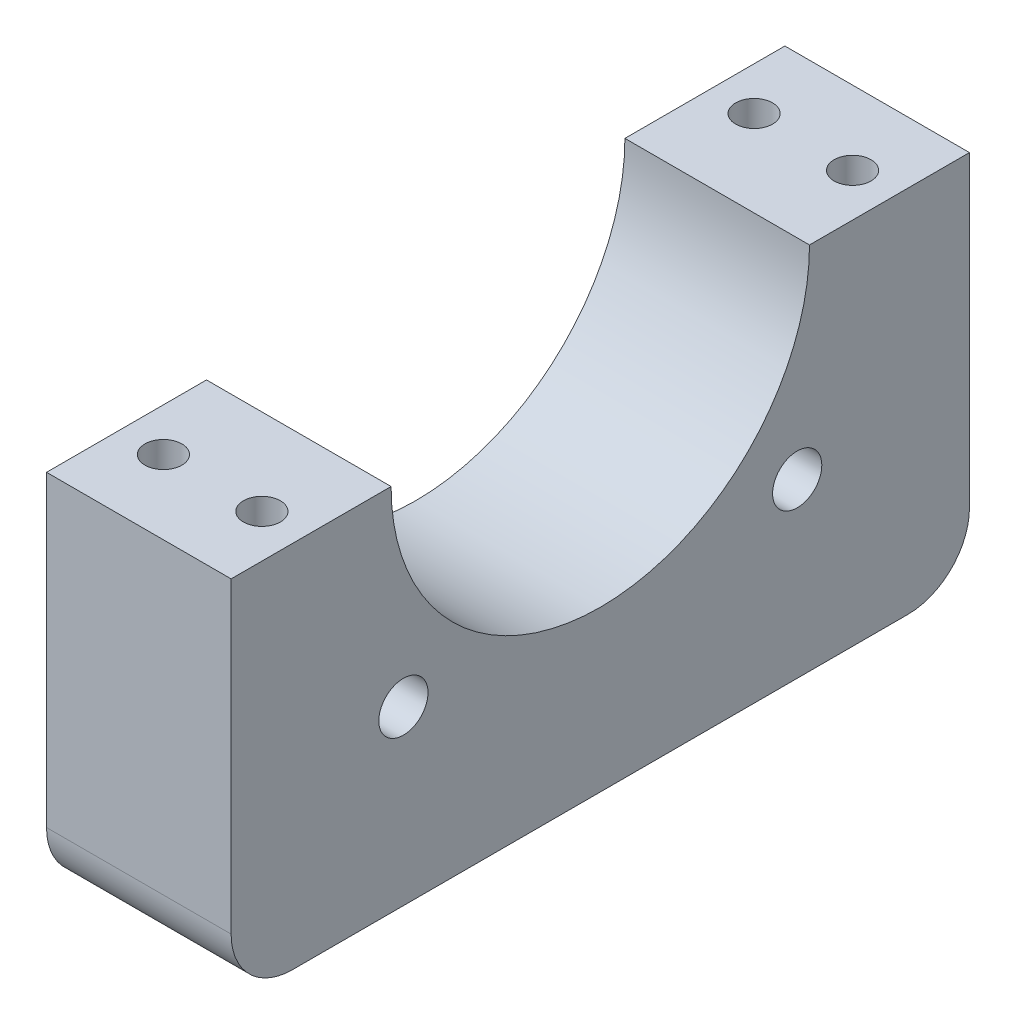
ISO-10303-21;
HEADER;
FILE_DESCRIPTION(('STEP AP214'),'2;1');
FILE_NAME('part.step','',(''),(''),'','','');
FILE_SCHEMA(('AUTOMOTIVE_DESIGN { 1 0 10303 214 1 1 1 1 }'));
ENDSEC;
DATA;
#1=APPLICATION_CONTEXT('core data for automotive mechanical design processes');
#2=APPLICATION_PROTOCOL_DEFINITION('international standard','automotive_design',2000,#1);
#3=PRODUCT_CONTEXT('',#1,'mechanical');
#4=PRODUCT('Part','Part','',(#3));
#5=PRODUCT_RELATED_PRODUCT_CATEGORY('part','',(#4));
#6=PRODUCT_DEFINITION_FORMATION('','',#4);
#7=PRODUCT_DEFINITION_CONTEXT('part definition',#1,'design');
#8=PRODUCT_DEFINITION('design','',#6,#7);
#9=PRODUCT_DEFINITION_SHAPE('','',#8);
#10=(LENGTH_UNIT() NAMED_UNIT(*) SI_UNIT(.MILLI.,.METRE.));
#11=(NAMED_UNIT(*) PLANE_ANGLE_UNIT() SI_UNIT($,.RADIAN.));
#12=(NAMED_UNIT(*) SI_UNIT($,.STERADIAN.) SOLID_ANGLE_UNIT());
#13=UNCERTAINTY_MEASURE_WITH_UNIT(LENGTH_MEASURE(1.E-05),#10,'distance_accuracy_value','');
#14=(GEOMETRIC_REPRESENTATION_CONTEXT(3) GLOBAL_UNCERTAINTY_ASSIGNED_CONTEXT((#13)) GLOBAL_UNIT_ASSIGNED_CONTEXT((#10,
#11,#12)) REPRESENTATION_CONTEXT('',''));
#15=CARTESIAN_POINT('',(0.,0.,0.));
#16=DIRECTION('',(0.,0.,1.));
#17=DIRECTION('',(1.,0.,0.));
#18=AXIS2_PLACEMENT_3D('',#15,#16,#17);
#19=CARTESIAN_POINT('',(-4.,-13.,-24.));
#20=DIRECTION('',(0.,1.,0.));
#21=DIRECTION('',(0.,0.,1.));
#22=AXIS2_PLACEMENT_3D('',#19,#20,#21);
#23=CYLINDRICAL_SURFACE('',#22,1.5);
#24=CARTESIAN_POINT('',(-4.,30.,-24.));
#25=DIRECTION('',(0.,1.,0.));
#26=DIRECTION('',(0.,0.,1.));
#27=AXIS2_PLACEMENT_3D('',#24,#25,#26);
#28=CIRCLE('',#27,1.5);
#29=CARTESIAN_POINT('',(-4.,30.,-22.5));
#30=VERTEX_POINT('',#29);
#31=EDGE_CURVE('E325',#30,#30,#28,.T.);
#32=ORIENTED_EDGE('',*,*,#31,.T.);
#33=EDGE_LOOP('',(#32));
#34=FACE_BOUND('',#33,.T.);
#35=CARTESIAN_POINT('',(-4.,10.,-24.));
#36=DIRECTION('',(0.,-1.,0.));
#37=DIRECTION('',(0.,0.,-1.));
#38=AXIS2_PLACEMENT_3D('',#35,#36,#37);
#39=CIRCLE('',#38,1.5);
#40=CARTESIAN_POINT('',(-4.,10.,-25.5));
#41=VERTEX_POINT('',#40);
#42=EDGE_CURVE('E186',#41,#41,#39,.F.);
#43=ORIENTED_EDGE('',*,*,#42,.F.);
#44=EDGE_LOOP('',(#43));
#45=FACE_BOUND('',#44,.T.);
#46=ADVANCED_FACE('F39',(#34,#45),#23,.F.);
#47=CARTESIAN_POINT('',(4.00000000000001,-13.,-24.));
#48=DIRECTION('',(0.,1.,0.));
#49=DIRECTION('',(0.,0.,1.));
#50=AXIS2_PLACEMENT_3D('',#47,#48,#49);
#51=CYLINDRICAL_SURFACE('',#50,1.5);
#52=CARTESIAN_POINT('',(4.00000000000001,30.,-24.));
#53=DIRECTION('',(0.,1.,0.));
#54=DIRECTION('',(0.,0.,1.));
#55=AXIS2_PLACEMENT_3D('',#52,#53,#54);
#56=CIRCLE('',#55,1.5);
#57=CARTESIAN_POINT('',(4.00000000000001,30.,-22.5));
#58=VERTEX_POINT('',#57);
#59=EDGE_CURVE('E322',#58,#58,#56,.T.);
#60=ORIENTED_EDGE('',*,*,#59,.T.);
#61=EDGE_LOOP('',(#60));
#62=FACE_BOUND('',#61,.T.);
#63=CARTESIAN_POINT('',(4.00000000000001,10.,-24.));
#64=DIRECTION('',(0.,-1.,0.));
#65=DIRECTION('',(0.,0.,-1.));
#66=AXIS2_PLACEMENT_3D('',#63,#64,#65);
#67=CIRCLE('',#66,1.5);
#68=CARTESIAN_POINT('',(4.00000000000001,10.,-25.5));
#69=VERTEX_POINT('',#68);
#70=EDGE_CURVE('E183',#69,#69,#67,.F.);
#71=ORIENTED_EDGE('',*,*,#70,.F.);
#72=EDGE_LOOP('',(#71));
#73=FACE_BOUND('',#72,.T.);
#74=ADVANCED_FACE('F353',(#62,#73),#51,.F.);
#75=CARTESIAN_POINT('',(4.00000000000001,-13.,24.));
#76=DIRECTION('',(0.,1.,0.));
#77=DIRECTION('',(0.,0.,1.));
#78=AXIS2_PLACEMENT_3D('',#75,#76,#77);
#79=CYLINDRICAL_SURFACE('',#78,1.5);
#80=CARTESIAN_POINT('',(4.00000000000001,30.,24.));
#81=DIRECTION('',(0.,1.,0.));
#82=DIRECTION('',(0.,0.,1.));
#83=AXIS2_PLACEMENT_3D('',#80,#81,#82);
#84=CIRCLE('',#83,1.5);
#85=CARTESIAN_POINT('',(4.00000000000001,30.,25.5));
#86=VERTEX_POINT('',#85);
#87=EDGE_CURVE('E310',#86,#86,#84,.T.);
#88=ORIENTED_EDGE('',*,*,#87,.T.);
#89=EDGE_LOOP('',(#88));
#90=FACE_BOUND('',#89,.T.);
#91=CARTESIAN_POINT('',(4.00000000000001,10.,24.));
#92=DIRECTION('',(0.,-1.,0.));
#93=DIRECTION('',(0.,0.,-1.));
#94=AXIS2_PLACEMENT_3D('',#91,#92,#93);
#95=CIRCLE('',#94,1.5);
#96=CARTESIAN_POINT('',(4.00000000000001,10.,22.5));
#97=VERTEX_POINT('',#96);
#98=EDGE_CURVE('E179',#97,#97,#95,.F.);
#99=ORIENTED_EDGE('',*,*,#98,.F.);
#100=EDGE_LOOP('',(#99));
#101=FACE_BOUND('',#100,.T.);
#102=ADVANCED_FACE('F359',(#90,#101),#79,.F.);
#103=CARTESIAN_POINT('',(-4.,-13.,24.));
#104=DIRECTION('',(0.,1.,0.));
#105=DIRECTION('',(0.,0.,1.));
#106=AXIS2_PLACEMENT_3D('',#103,#104,#105);
#107=CYLINDRICAL_SURFACE('',#106,1.5);
#108=CARTESIAN_POINT('',(-4.,30.,24.));
#109=DIRECTION('',(0.,1.,0.));
#110=DIRECTION('',(0.,0.,1.));
#111=AXIS2_PLACEMENT_3D('',#108,#109,#110);
#112=CIRCLE('',#111,1.5);
#113=CARTESIAN_POINT('',(-4.,30.,25.5));
#114=VERTEX_POINT('',#113);
#115=EDGE_CURVE('E321',#114,#114,#112,.T.);
#116=ORIENTED_EDGE('',*,*,#115,.T.);
#117=EDGE_LOOP('',(#116));
#118=FACE_BOUND('',#117,.T.);
#119=CARTESIAN_POINT('',(-4.,10.,24.));
#120=DIRECTION('',(0.,-1.,0.));
#121=DIRECTION('',(0.,0.,-1.));
#122=AXIS2_PLACEMENT_3D('',#119,#120,#121);
#123=CIRCLE('',#122,1.5);
#124=CARTESIAN_POINT('',(-4.,10.,22.5));
#125=VERTEX_POINT('',#124);
#126=EDGE_CURVE('E176',#125,#125,#123,.F.);
#127=ORIENTED_EDGE('',*,*,#126,.F.);
#128=EDGE_LOOP('',(#127));
#129=FACE_BOUND('',#128,.T.);
#130=ADVANCED_FACE('F364',(#118,#129),#107,.F.);
#131=CARTESIAN_POINT('',(-7.5,70.,30.));
#132=DIRECTION('',(1.,0.,0.));
#133=DIRECTION('',(0.,0.,-1.));
#134=AXIS2_PLACEMENT_3D('',#131,#132,#133);
#135=PLANE('',#134);
#136=DIRECTION('',(0.,0.,1.));
#137=VECTOR('',#136,1.);
#138=CARTESIAN_POINT('',(-7.5,0.,30.));
#139=LINE('',#138,#137);
#140=CARTESIAN_POINT('',(-7.5,0.,-25.));
#141=VERTEX_POINT('',#140);
#142=CARTESIAN_POINT('',(-7.5,0.,25.));
#143=VERTEX_POINT('',#142);
#144=EDGE_CURVE('E266',#141,#143,#139,.T.);
#145=ORIENTED_EDGE('',*,*,#144,.T.);
#146=CARTESIAN_POINT('',(-7.5,5.,25.));
#147=DIRECTION('',(1.,0.,0.));
#148=DIRECTION('',(0.,0.,-1.));
#149=AXIS2_PLACEMENT_3D('',#146,#147,#148);
#150=CIRCLE('',#149,5.);
#151=CARTESIAN_POINT('',(-7.5,5.,30.));
#152=VERTEX_POINT('',#151);
#153=EDGE_CURVE('E249',#143,#152,#150,.F.);
#154=ORIENTED_EDGE('',*,*,#153,.T.);
#155=DIRECTION('',(0.,-1.,0.));
#156=VECTOR('',#155,1.);
#157=CARTESIAN_POINT('',(-7.5,70.,30.));
#158=LINE('',#157,#156);
#159=CARTESIAN_POINT('',(-7.5,30.,30.));
#160=VERTEX_POINT('',#159);
#161=EDGE_CURVE('E162',#160,#152,#158,.T.);
#162=ORIENTED_EDGE('',*,*,#161,.F.);
#163=DIRECTION('',(0.,0.,-1.));
#164=VECTOR('',#163,1.);
#165=CARTESIAN_POINT('',(-7.5,30.,30.));
#166=LINE('',#165,#164);
#167=CARTESIAN_POINT('',(-7.5,30.,17.));
#168=VERTEX_POINT('',#167);
#169=EDGE_CURVE('E141',#160,#168,#166,.T.);
#170=ORIENTED_EDGE('',*,*,#169,.T.);
#171=CARTESIAN_POINT('',(-7.5,30.,0.));
#172=DIRECTION('',(1.,0.,0.));
#173=DIRECTION('',(0.,0.,-1.));
#174=AXIS2_PLACEMENT_3D('',#171,#172,#173);
#175=CIRCLE('',#174,17.);
#176=CARTESIAN_POINT('',(-7.5,30.,-17.));
#177=VERTEX_POINT('',#176);
#178=EDGE_CURVE('E268',#168,#177,#175,.T.);
#179=ORIENTED_EDGE('',*,*,#178,.T.);
#180=CARTESIAN_POINT('',(-7.5,30.,-30.));
#181=VERTEX_POINT('',#180);
#182=EDGE_CURVE('E277',#177,#181,#166,.T.);
#183=ORIENTED_EDGE('',*,*,#182,.T.);
#184=DIRECTION('',(0.,-1.,0.));
#185=VECTOR('',#184,1.);
#186=CARTESIAN_POINT('',(-7.5,70.,-30.));
#187=LINE('',#186,#185);
#188=CARTESIAN_POINT('',(-7.5,5.,-30.));
#189=VERTEX_POINT('',#188);
#190=EDGE_CURVE('E168',#181,#189,#187,.T.);
#191=ORIENTED_EDGE('',*,*,#190,.T.);
#192=CARTESIAN_POINT('',(-7.5,5.,-25.));
#193=DIRECTION('',(1.,0.,0.));
#194=DIRECTION('',(0.,0.,-1.));
#195=AXIS2_PLACEMENT_3D('',#192,#193,#194);
#196=CIRCLE('',#195,5.);
#197=EDGE_CURVE('E60',#189,#141,#196,.F.);
#198=ORIENTED_EDGE('',*,*,#197,.T.);
#199=EDGE_LOOP('',(#145,#154,#162,#170,#179,#183,#191,#198));
#200=FACE_BOUND('',#199,.T.);
#201=ADVANCED_FACE('F265',(#200),#135,.F.);
#202=CARTESIAN_POINT('',(7.5,70.,30.));
#203=DIRECTION('',(0.,0.,-1.));
#204=DIRECTION('',(-1.,0.,0.));
#205=AXIS2_PLACEMENT_3D('',#202,#203,#204);
#206=PLANE('',#205);
#207=ORIENTED_EDGE('',*,*,#161,.T.);
#208=DIRECTION('',(1.,0.,0.));
#209=VECTOR('',#208,1.);
#210=CARTESIAN_POINT('',(7.5,5.,30.));
#211=LINE('',#210,#209);
#212=CARTESIAN_POINT('',(7.5,5.,30.));
#213=VERTEX_POINT('',#212);
#214=EDGE_CURVE('E161',#152,#213,#211,.T.);
#215=ORIENTED_EDGE('',*,*,#214,.T.);
#216=DIRECTION('',(0.,-1.,0.));
#217=VECTOR('',#216,1.);
#218=CARTESIAN_POINT('',(7.5,70.,30.));
#219=LINE('',#218,#217);
#220=CARTESIAN_POINT('',(7.5,30.,30.));
#221=VERTEX_POINT('',#220);
#222=EDGE_CURVE('E152',#221,#213,#219,.T.);
#223=ORIENTED_EDGE('',*,*,#222,.F.);
#224=DIRECTION('',(1.,0.,0.));
#225=VECTOR('',#224,1.);
#226=CARTESIAN_POINT('',(-21.5,30.,30.));
#227=LINE('',#226,#225);
#228=EDGE_CURVE('E135',#160,#221,#227,.T.);
#229=ORIENTED_EDGE('',*,*,#228,.F.);
#230=EDGE_LOOP('',(#207,#215,#223,#229));
#231=FACE_BOUND('',#230,.T.);
#232=ADVANCED_FACE('F159',(#231),#206,.F.);
#233=CARTESIAN_POINT('',(7.5,70.,30.));
#234=DIRECTION('',(-1.,0.,0.));
#235=DIRECTION('',(0.,0.,1.));
#236=AXIS2_PLACEMENT_3D('',#233,#234,#235);
#237=PLANE('',#236);
#238=CARTESIAN_POINT('',(7.5,14.,16.));
#239=DIRECTION('',(1.,0.,0.));
#240=DIRECTION('',(0.,0.,-1.));
#241=AXIS2_PLACEMENT_3D('',#238,#239,#240);
#242=CIRCLE('',#241,2.);
#243=CARTESIAN_POINT('',(7.5,14.,14.));
#244=VERTEX_POINT('',#243);
#245=EDGE_CURVE('E311',#244,#244,#242,.T.);
#246=ORIENTED_EDGE('',*,*,#245,.F.);
#247=EDGE_LOOP('',(#246));
#248=FACE_BOUND('',#247,.T.);
#249=CARTESIAN_POINT('',(7.5,14.,-16.));
#250=DIRECTION('',(1.,0.,0.));
#251=DIRECTION('',(0.,0.,-1.));
#252=AXIS2_PLACEMENT_3D('',#249,#250,#251);
#253=CIRCLE('',#252,2.);
#254=CARTESIAN_POINT('',(7.5,14.,-18.));
#255=VERTEX_POINT('',#254);
#256=EDGE_CURVE('E314',#255,#255,#253,.T.);
#257=ORIENTED_EDGE('',*,*,#256,.F.);
#258=EDGE_LOOP('',(#257));
#259=FACE_BOUND('',#258,.T.);
#260=ORIENTED_EDGE('',*,*,#222,.T.);
#261=CARTESIAN_POINT('',(7.5,5.,25.));
#262=DIRECTION('',(-1.,0.,0.));
#263=DIRECTION('',(0.,0.,1.));
#264=AXIS2_PLACEMENT_3D('',#261,#262,#263);
#265=CIRCLE('',#264,5.);
#266=CARTESIAN_POINT('',(7.5,0.,25.));
#267=VERTEX_POINT('',#266);
#268=EDGE_CURVE('E193',#213,#267,#265,.F.);
#269=ORIENTED_EDGE('',*,*,#268,.T.);
#270=DIRECTION('',(0.,0.,-1.));
#271=VECTOR('',#270,1.);
#272=CARTESIAN_POINT('',(7.5,0.,30.));
#273=LINE('',#272,#271);
#274=CARTESIAN_POINT('',(7.5,0.,-25.));
#275=VERTEX_POINT('',#274);
#276=EDGE_CURVE('E267',#267,#275,#273,.T.);
#277=ORIENTED_EDGE('',*,*,#276,.T.);
#278=CARTESIAN_POINT('',(7.5,5.,-25.));
#279=DIRECTION('',(-1.,0.,0.));
#280=DIRECTION('',(0.,0.,1.));
#281=AXIS2_PLACEMENT_3D('',#278,#279,#280);
#282=CIRCLE('',#281,5.);
#283=CARTESIAN_POINT('',(7.5,5.,-30.));
#284=VERTEX_POINT('',#283);
#285=EDGE_CURVE('E191',#275,#284,#282,.F.);
#286=ORIENTED_EDGE('',*,*,#285,.T.);
#287=DIRECTION('',(0.,-1.,0.));
#288=VECTOR('',#287,1.);
#289=CARTESIAN_POINT('',(7.5,70.,-30.));
#290=LINE('',#289,#288);
#291=CARTESIAN_POINT('',(7.5,30.,-30.));
#292=VERTEX_POINT('',#291);
#293=EDGE_CURVE('E163',#292,#284,#290,.T.);
#294=ORIENTED_EDGE('',*,*,#293,.F.);
#295=DIRECTION('',(0.,0.,-1.));
#296=VECTOR('',#295,1.);
#297=CARTESIAN_POINT('',(7.5,30.,30.));
#298=LINE('',#297,#296);
#299=CARTESIAN_POINT('',(7.50000000000001,30.,-17.));
#300=VERTEX_POINT('',#299);
#301=EDGE_CURVE('E156',#300,#292,#298,.T.);
#302=ORIENTED_EDGE('',*,*,#301,.F.);
#303=CARTESIAN_POINT('',(7.5,30.,0.));
#304=DIRECTION('',(1.,0.,0.));
#305=DIRECTION('',(0.,0.,-1.));
#306=AXIS2_PLACEMENT_3D('',#303,#304,#305);
#307=CIRCLE('',#306,17.);
#308=CARTESIAN_POINT('',(7.5,30.,17.));
#309=VERTEX_POINT('',#308);
#310=EDGE_CURVE('E155',#309,#300,#307,.T.);
#311=ORIENTED_EDGE('',*,*,#310,.F.);
#312=EDGE_CURVE('E138',#221,#309,#298,.T.);
#313=ORIENTED_EDGE('',*,*,#312,.F.);
#314=EDGE_LOOP('',(#260,#269,#277,#286,#294,#302,#311,#313));
#315=FACE_BOUND('',#314,.T.);
#316=ADVANCED_FACE('F151',(#248,#259,#315),#237,.F.);
#317=CARTESIAN_POINT('',(7.5,70.,-30.));
#318=DIRECTION('',(0.,0.,1.));
#319=DIRECTION('',(1.,0.,0.));
#320=AXIS2_PLACEMENT_3D('',#317,#318,#319);
#321=PLANE('',#320);
#322=ORIENTED_EDGE('',*,*,#293,.T.);
#323=DIRECTION('',(-1.,0.,0.));
#324=VECTOR('',#323,1.);
#325=CARTESIAN_POINT('',(7.5,5.,-30.));
#326=LINE('',#325,#324);
#327=EDGE_CURVE('E247',#284,#189,#326,.T.);
#328=ORIENTED_EDGE('',*,*,#327,.T.);
#329=ORIENTED_EDGE('',*,*,#190,.F.);
#330=DIRECTION('',(1.,0.,0.));
#331=VECTOR('',#330,1.);
#332=CARTESIAN_POINT('',(-21.5,30.,-30.));
#333=LINE('',#332,#331);
#334=EDGE_CURVE('E146',#181,#292,#333,.T.);
#335=ORIENTED_EDGE('',*,*,#334,.T.);
#336=EDGE_LOOP('',(#322,#328,#329,#335));
#337=FACE_BOUND('',#336,.T.);
#338=ADVANCED_FACE('F280',(#337),#321,.F.);
#339=CARTESIAN_POINT('',(0.,0.,0.));
#340=DIRECTION('',(0.,1.,0.));
#341=DIRECTION('',(0.,0.,1.));
#342=AXIS2_PLACEMENT_3D('',#339,#340,#341);
#343=PLANE('',#342);
#344=ORIENTED_EDGE('',*,*,#276,.F.);
#345=DIRECTION('',(1.,0.,0.));
#346=VECTOR('',#345,1.);
#347=CARTESIAN_POINT('',(0.,0.,25.));
#348=LINE('',#347,#346);
#349=CARTESIAN_POINT('',(6.8284271247462,0.,25.));
#350=VERTEX_POINT('',#349);
#351=EDGE_CURVE('E204',#267,#350,#348,.F.);
#352=ORIENTED_EDGE('',*,*,#351,.T.);
#353=CARTESIAN_POINT('',(4.00000000000001,0.,24.));
#354=DIRECTION('',(0.,-1.,0.));
#355=DIRECTION('',(0.,0.,-1.));
#356=AXIS2_PLACEMENT_3D('',#353,#354,#355);
#357=CIRCLE('',#356,3.);
#358=CARTESIAN_POINT('',(1.17157287525381,0.,25.));
#359=VERTEX_POINT('',#358);
#360=EDGE_CURVE('E261',#359,#350,#357,.T.);
#361=ORIENTED_EDGE('',*,*,#360,.F.);
#362=DIRECTION('',(1.,0.,0.));
#363=VECTOR('',#362,1.);
#364=CARTESIAN_POINT('',(0.,0.,25.));
#365=LINE('',#364,#363);
#366=CARTESIAN_POINT('',(-1.1715728752538,0.,25.));
#367=VERTEX_POINT('',#366);
#368=EDGE_CURVE('E202',#359,#367,#365,.F.);
#369=ORIENTED_EDGE('',*,*,#368,.T.);
#370=CARTESIAN_POINT('',(-4.,0.,24.));
#371=DIRECTION('',(0.,-1.,0.));
#372=DIRECTION('',(0.,0.,-1.));
#373=AXIS2_PLACEMENT_3D('',#370,#371,#372);
#374=CIRCLE('',#373,3.);
#375=CARTESIAN_POINT('',(-6.8284271247462,0.,25.));
#376=VERTEX_POINT('',#375);
#377=EDGE_CURVE('E255',#376,#367,#374,.T.);
#378=ORIENTED_EDGE('',*,*,#377,.F.);
#379=DIRECTION('',(1.,0.,0.));
#380=VECTOR('',#379,1.);
#381=CARTESIAN_POINT('',(0.,0.,25.));
#382=LINE('',#381,#380);
#383=EDGE_CURVE('E68',#376,#143,#382,.F.);
#384=ORIENTED_EDGE('',*,*,#383,.T.);
#385=ORIENTED_EDGE('',*,*,#144,.F.);
#386=DIRECTION('',(-1.,0.,0.));
#387=VECTOR('',#386,1.);
#388=CARTESIAN_POINT('',(0.,0.,-25.));
#389=LINE('',#388,#387);
#390=CARTESIAN_POINT('',(-6.82842712474619,0.,-25.));
#391=VERTEX_POINT('',#390);
#392=EDGE_CURVE('E199',#141,#391,#389,.F.);
#393=ORIENTED_EDGE('',*,*,#392,.T.);
#394=CARTESIAN_POINT('',(-4.,0.,-24.));
#395=DIRECTION('',(0.,-1.,0.));
#396=DIRECTION('',(0.,0.,-1.));
#397=AXIS2_PLACEMENT_3D('',#394,#395,#396);
#398=CIRCLE('',#397,3.);
#399=CARTESIAN_POINT('',(-1.17157287525381,0.,-25.));
#400=VERTEX_POINT('',#399);
#401=EDGE_CURVE('E293',#400,#391,#398,.T.);
#402=ORIENTED_EDGE('',*,*,#401,.F.);
#403=DIRECTION('',(-1.,0.,0.));
#404=VECTOR('',#403,1.);
#405=CARTESIAN_POINT('',(0.,0.,-25.));
#406=LINE('',#405,#404);
#407=CARTESIAN_POINT('',(1.17157287525382,0.,-25.));
#408=VERTEX_POINT('',#407);
#409=EDGE_CURVE('E197',#400,#408,#406,.F.);
#410=ORIENTED_EDGE('',*,*,#409,.T.);
#411=CARTESIAN_POINT('',(4.00000000000001,0.,-24.));
#412=DIRECTION('',(0.,-1.,0.));
#413=DIRECTION('',(0.,0.,-1.));
#414=AXIS2_PLACEMENT_3D('',#411,#412,#413);
#415=CIRCLE('',#414,3.);
#416=CARTESIAN_POINT('',(6.8284271247462,0.,-25.));
#417=VERTEX_POINT('',#416);
#418=EDGE_CURVE('E304',#417,#408,#415,.T.);
#419=ORIENTED_EDGE('',*,*,#418,.F.);
#420=DIRECTION('',(-1.,0.,0.));
#421=VECTOR('',#420,1.);
#422=CARTESIAN_POINT('',(0.,0.,-25.));
#423=LINE('',#422,#421);
#424=EDGE_CURVE('E195',#417,#275,#423,.F.);
#425=ORIENTED_EDGE('',*,*,#424,.T.);
#426=EDGE_LOOP('',(#344,#352,#361,#369,#378,#384,#385,#393,#402,#410,#419,#425));
#427=FACE_BOUND('',#426,.T.);
#428=ADVANCED_FACE('F259',(#427),#343,.F.);
#429=CARTESIAN_POINT('',(-62.5,30.,0.));
#430=DIRECTION('',(1.,0.,0.));
#431=DIRECTION('',(0.,0.,-1.));
#432=AXIS2_PLACEMENT_3D('',#429,#430,#431);
#433=CYLINDRICAL_SURFACE('',#432,17.);
#434=ORIENTED_EDGE('',*,*,#310,.T.);
#435=DIRECTION('',(1.,0.,0.));
#436=VECTOR('',#435,1.);
#437=CARTESIAN_POINT('',(-62.5,30.,-17.));
#438=LINE('',#437,#436);
#439=EDGE_CURVE('E173',#300,#177,#438,.F.);
#440=ORIENTED_EDGE('',*,*,#439,.T.);
#441=ORIENTED_EDGE('',*,*,#178,.F.);
#442=DIRECTION('',(1.,0.,0.));
#443=VECTOR('',#442,1.);
#444=CARTESIAN_POINT('',(-62.5,30.,17.));
#445=LINE('',#444,#443);
#446=EDGE_CURVE('E165',#168,#309,#445,.T.);
#447=ORIENTED_EDGE('',*,*,#446,.T.);
#448=EDGE_LOOP('',(#434,#440,#441,#447));
#449=FACE_BOUND('',#448,.T.);
#450=ADVANCED_FACE('F332',(#449),#433,.F.);
#451=CARTESIAN_POINT('',(-21.5,30.,30.));
#452=DIRECTION('',(0.,-1.,0.));
#453=DIRECTION('',(0.,0.,-1.));
#454=AXIS2_PLACEMENT_3D('',#451,#452,#453);
#455=PLANE('',#454);
#456=ORIENTED_EDGE('',*,*,#115,.F.);
#457=EDGE_LOOP('',(#456));
#458=FACE_BOUND('',#457,.T.);
#459=ORIENTED_EDGE('',*,*,#87,.F.);
#460=EDGE_LOOP('',(#459));
#461=FACE_BOUND('',#460,.T.);
#462=ORIENTED_EDGE('',*,*,#228,.T.);
#463=ORIENTED_EDGE('',*,*,#312,.T.);
#464=ORIENTED_EDGE('',*,*,#446,.F.);
#465=ORIENTED_EDGE('',*,*,#169,.F.);
#466=EDGE_LOOP('',(#462,#463,#464,#465));
#467=FACE_BOUND('',#466,.T.);
#468=ADVANCED_FACE('F137',(#458,#461,#467),#455,.F.);
#469=ORIENTED_EDGE('',*,*,#59,.F.);
#470=EDGE_LOOP('',(#469));
#471=FACE_BOUND('',#470,.T.);
#472=ORIENTED_EDGE('',*,*,#31,.F.);
#473=EDGE_LOOP('',(#472));
#474=FACE_BOUND('',#473,.T.);
#475=ORIENTED_EDGE('',*,*,#439,.F.);
#476=ORIENTED_EDGE('',*,*,#301,.T.);
#477=ORIENTED_EDGE('',*,*,#334,.F.);
#478=ORIENTED_EDGE('',*,*,#182,.F.);
#479=EDGE_LOOP('',(#475,#476,#477,#478));
#480=FACE_BOUND('',#479,.T.);
#481=ADVANCED_FACE('F335',(#471,#474,#480),#455,.F.);
#482=CARTESIAN_POINT('',(-2.5,14.,-16.));
#483=DIRECTION('',(1.,0.,0.));
#484=DIRECTION('',(0.,0.,-1.));
#485=AXIS2_PLACEMENT_3D('',#482,#483,#484);
#486=CYLINDRICAL_SURFACE('',#485,2.);
#487=CARTESIAN_POINT('',(-2.5,14.,-16.));
#488=DIRECTION('',(1.,0.,0.));
#489=DIRECTION('',(0.,0.,-1.));
#490=AXIS2_PLACEMENT_3D('',#487,#488,#489);
#491=CIRCLE('',#490,2.);
#492=CARTESIAN_POINT('',(-2.5,14.,-18.));
#493=VERTEX_POINT('',#492);
#494=EDGE_CURVE('E189',#493,#493,#491,.T.);
#495=ORIENTED_EDGE('',*,*,#494,.F.);
#496=EDGE_LOOP('',(#495));
#497=FACE_BOUND('',#496,.T.);
#498=ORIENTED_EDGE('',*,*,#256,.T.);
#499=EDGE_LOOP('',(#498));
#500=FACE_BOUND('',#499,.T.);
#501=ADVANCED_FACE('F337',(#497,#500),#486,.F.);
#502=CARTESIAN_POINT('',(-2.5,14.,-16.));
#503=DIRECTION('',(1.,0.,0.));
#504=DIRECTION('',(0.,0.,-1.));
#505=AXIS2_PLACEMENT_3D('',#502,#503,#504);
#506=PLANE('',#505);
#507=ORIENTED_EDGE('',*,*,#494,.T.);
#508=EDGE_LOOP('',(#507));
#509=FACE_BOUND('',#508,.T.);
#510=ADVANCED_FACE('F344',(#509),#506,.T.);
#511=CARTESIAN_POINT('',(-2.5,14.,16.));
#512=DIRECTION('',(1.,0.,0.));
#513=DIRECTION('',(0.,0.,-1.));
#514=AXIS2_PLACEMENT_3D('',#511,#512,#513);
#515=CYLINDRICAL_SURFACE('',#514,2.);
#516=CARTESIAN_POINT('',(-2.5,14.,16.));
#517=DIRECTION('',(1.,0.,0.));
#518=DIRECTION('',(0.,0.,-1.));
#519=AXIS2_PLACEMENT_3D('',#516,#517,#518);
#520=CIRCLE('',#519,2.);
#521=CARTESIAN_POINT('',(-2.5,14.,14.));
#522=VERTEX_POINT('',#521);
#523=EDGE_CURVE('E307',#522,#522,#520,.T.);
#524=ORIENTED_EDGE('',*,*,#523,.F.);
#525=EDGE_LOOP('',(#524));
#526=FACE_BOUND('',#525,.T.);
#527=ORIENTED_EDGE('',*,*,#245,.T.);
#528=EDGE_LOOP('',(#527));
#529=FACE_BOUND('',#528,.T.);
#530=ADVANCED_FACE('F372',(#526,#529),#515,.F.);
#531=CARTESIAN_POINT('',(-2.5,14.,16.));
#532=DIRECTION('',(1.,0.,0.));
#533=DIRECTION('',(0.,0.,-1.));
#534=AXIS2_PLACEMENT_3D('',#531,#532,#533);
#535=PLANE('',#534);
#536=ORIENTED_EDGE('',*,*,#523,.T.);
#537=EDGE_LOOP('',(#536));
#538=FACE_BOUND('',#537,.T.);
#539=ADVANCED_FACE('F377',(#538),#535,.T.);
#540=CARTESIAN_POINT('',(-4.,10.,24.));
#541=DIRECTION('',(0.,-1.,0.));
#542=DIRECTION('',(0.,0.,-1.));
#543=AXIS2_PLACEMENT_3D('',#540,#541,#542);
#544=PLANE('',#543);
#545=CARTESIAN_POINT('',(-4.,10.,24.));
#546=DIRECTION('',(0.,-1.,0.));
#547=DIRECTION('',(0.,0.,-1.));
#548=AXIS2_PLACEMENT_3D('',#545,#546,#547);
#549=CIRCLE('',#548,3.);
#550=CARTESIAN_POINT('',(-4.,10.,21.));
#551=VERTEX_POINT('',#550);
#552=EDGE_CURVE('E180',#551,#551,#549,.T.);
#553=ORIENTED_EDGE('',*,*,#552,.T.);
#554=EDGE_LOOP('',(#553));
#555=FACE_BOUND('',#554,.T.);
#556=ORIENTED_EDGE('',*,*,#126,.T.);
#557=EDGE_LOOP('',(#556));
#558=FACE_BOUND('',#557,.T.);
#559=ADVANCED_FACE('F379',(#555,#558),#544,.T.);
#560=CARTESIAN_POINT('',(-4.,10.,24.));
#561=DIRECTION('',(0.,-1.,0.));
#562=DIRECTION('',(0.,0.,-1.));
#563=AXIS2_PLACEMENT_3D('',#560,#561,#562);
#564=CYLINDRICAL_SURFACE('',#563,3.);
#565=ORIENTED_EDGE('',*,*,#552,.F.);
#566=EDGE_LOOP('',(#565));
#567=FACE_BOUND('',#566,.T.);
#568=ORIENTED_EDGE('',*,*,#377,.T.);
#569=CARTESIAN_POINT('',(-1.1715728752538,0.,25.));
#570=CARTESIAN_POINT('',(-1.19861552739612,-1.2160654415601E-05,25.0765261104712));
#571=CARTESIAN_POINT('',(-1.22877954376367,0.00175648664153592,25.1519249231383));
#572=CARTESIAN_POINT('',(-1.29502742595458,0.00845476372028557,25.2998723615229));
#573=CARTESIAN_POINT('',(-1.33110730898663,0.0133822732843764,25.3724228643806));
#574=CARTESIAN_POINT('',(-1.40873281294025,0.0259713991878988,25.5138754818277));
#575=CARTESIAN_POINT('',(-1.45025410835455,0.0336210929156504,25.5827920244985));
#576=CARTESIAN_POINT('',(-1.53853253835464,0.051194090512354,25.716865644095));
#577=CARTESIAN_POINT('',(-1.58529044773247,0.0611177310547419,25.7820221625333));
#578=CARTESIAN_POINT('',(-1.732687652063,0.0935265185931065,25.9709717786325));
#579=CARTESIAN_POINT('',(-1.84069285034489,0.118694045085477,26.0886840883345));
#580=CARTESIAN_POINT('',(-2.0736097031039,0.172091205425352,26.3052977685655));
#581=CARTESIAN_POINT('',(-2.19854381822944,0.200324897293515,26.404173721151));
#582=CARTESIAN_POINT('',(-2.47109305446643,0.257414686138757,26.5866959407506));
#583=CARTESIAN_POINT('',(-2.61964486079881,0.286196370476672,26.6689755858263));
#584=CARTESIAN_POINT('',(-2.92936653701792,0.337580234082044,26.8075794345457));
#585=CARTESIAN_POINT('',(-3.09053022112421,0.360185418618123,26.8639162702305));
#586=CARTESIAN_POINT('',(-3.41875313595928,0.394832851591632,26.9479484038017));
#587=CARTESIAN_POINT('',(-3.58568975531411,0.407026531976064,26.9760553980128));
#588=CARTESIAN_POINT('',(-3.92231580952896,0.419030138631354,27.0037390389029));
#589=CARTESIAN_POINT('',(-4.09200374512157,0.418846596921735,27.0033307343899));
#590=CARTESIAN_POINT('',(-4.41567794566619,0.406646486485435,26.9751653683508));
#591=CARTESIAN_POINT('',(-4.56988432765097,0.395522073130982,26.9494701861196));
#592=CARTESIAN_POINT('',(-4.87163524163194,0.364617299223457,26.8747912552703));
#593=CARTESIAN_POINT('',(-5.01917800789839,0.344834659081241,26.8258013731919));
#594=CARTESIAN_POINT('',(-5.30797499435997,0.299050628082394,26.7045129424324));
#595=CARTESIAN_POINT('',(-5.44895917718101,0.272898413700438,26.6316314417493));
#596=CARTESIAN_POINT('',(-5.71752128604428,0.218566416697321,26.4647792068317));
#597=CARTESIAN_POINT('',(-5.84508890412455,0.190385102717293,26.3707924286979));
#598=CARTESIAN_POINT('',(-6.09330758128963,0.134033439881899,26.155705205438));
#599=CARTESIAN_POINT('',(-6.21267934702872,0.106029445888383,26.033078858519));
#600=CARTESIAN_POINT('',(-6.42929200673253,0.0575958990744215,25.7685132227055));
#601=CARTESIAN_POINT('',(-6.52657609714941,0.0371515119534518,25.6266125127852));
#602=CARTESIAN_POINT('',(-6.65415886495534,0.0155270903612119,25.4011039109622));
#603=CARTESIAN_POINT('',(-6.69387698472035,0.00981750328661886,25.3231321708826));
#604=CARTESIAN_POINT('',(-6.7664088482145,0.00204905922295243,25.1638898679205));
#605=CARTESIAN_POINT('',(-6.79922401025322,-1.05483525914816E-05,25.0826199867889));
#606=CARTESIAN_POINT('',(-6.8284271247462,0.,25.));
#607=B_SPLINE_CURVE_WITH_KNOTS('',3,(#569,#570,#571,#572,#573,#574,#575,#576,#577,#578,#579,
#580,#581,#582,#583,#584,#585,#586,#587,#588,#589,#590,#591,#592,#593,#594,#595,#596,#597,#598,
#599,#600,#601,#602,#603,#604,#605,#606),.UNSPECIFIED.,.F.,.F.,(4,2,2,2,2,2,2,2,2,2,2,2,2,2,2,2,
2,2,4),(0.,0.243370315015975,0.486577451403694,0.7287322415262,0.970922907519696,
1.45381201462422,1.93734819113477,2.45160360618801,2.96560835516203,3.47200313582407,
3.9781306711649,4.44614305899371,4.91427874208658,5.39481268631141,5.87571316897753,
6.39346833258093,6.9102020387727,7.17291150906301,7.4355669491689),.UNSPECIFIED.);
#608=EDGE_CURVE('E213',#367,#376,#607,.T.);
#609=ORIENTED_EDGE('',*,*,#608,.T.);
#610=EDGE_LOOP('',(#568,#609));
#611=FACE_BOUND('',#610,.T.);
#612=ADVANCED_FACE('F233',(#567,#611),#564,.F.);
#613=CARTESIAN_POINT('',(4.00000000000001,10.,24.));
#614=DIRECTION('',(0.,-1.,0.));
#615=DIRECTION('',(0.,0.,-1.));
#616=AXIS2_PLACEMENT_3D('',#613,#614,#615);
#617=PLANE('',#616);
#618=CARTESIAN_POINT('',(4.00000000000001,10.,24.));
#619=DIRECTION('',(0.,-1.,0.));
#620=DIRECTION('',(0.,0.,-1.));
#621=AXIS2_PLACEMENT_3D('',#618,#619,#620);
#622=CIRCLE('',#621,3.);
#623=CARTESIAN_POINT('',(4.00000000000001,10.,21.));
#624=VERTEX_POINT('',#623);
#625=EDGE_CURVE('E290',#624,#624,#622,.T.);
#626=ORIENTED_EDGE('',*,*,#625,.T.);
#627=EDGE_LOOP('',(#626));
#628=FACE_BOUND('',#627,.T.);
#629=ORIENTED_EDGE('',*,*,#98,.T.);
#630=EDGE_LOOP('',(#629));
#631=FACE_BOUND('',#630,.T.);
#632=ADVANCED_FACE('F229',(#628,#631),#617,.T.);
#633=CARTESIAN_POINT('',(4.00000000000001,10.,24.));
#634=DIRECTION('',(0.,-1.,0.));
#635=DIRECTION('',(0.,0.,-1.));
#636=AXIS2_PLACEMENT_3D('',#633,#634,#635);
#637=CYLINDRICAL_SURFACE('',#636,3.);
#638=ORIENTED_EDGE('',*,*,#625,.F.);
#639=EDGE_LOOP('',(#638));
#640=FACE_BOUND('',#639,.T.);
#641=ORIENTED_EDGE('',*,*,#360,.T.);
#642=CARTESIAN_POINT('',(6.8284271247462,0.,25.));
#643=CARTESIAN_POINT('',(6.80138447260389,-1.21606544152768E-05,25.0765261104712));
#644=CARTESIAN_POINT('',(6.77122045623633,0.00175648664153628,25.1519249231383));
#645=CARTESIAN_POINT('',(6.70497257404543,0.00845476372028582,25.2998723615229));
#646=CARTESIAN_POINT('',(6.66889269101337,0.0133822732843765,25.3724228643806));
#647=CARTESIAN_POINT('',(6.59126718705975,0.0259713991878988,25.5138754818277));
#648=CARTESIAN_POINT('',(6.54974589164546,0.0336210929156504,25.5827920244985));
#649=CARTESIAN_POINT('',(6.46146746164537,0.051194090512354,25.716865644095));
#650=CARTESIAN_POINT('',(6.41470955226754,0.0611177310547418,25.7820221625333));
#651=CARTESIAN_POINT('',(6.26731234793701,0.0935265185931068,25.9709717786325));
#652=CARTESIAN_POINT('',(6.15930714965512,0.118694045085479,26.0886840883345));
#653=CARTESIAN_POINT('',(5.92639029689611,0.172091205425354,26.3052977685655));
#654=CARTESIAN_POINT('',(5.80145618177056,0.200324897293515,26.404173721151));
#655=CARTESIAN_POINT('',(5.52890694553357,0.257414686138756,26.5866959407506));
#656=CARTESIAN_POINT('',(5.38035513920119,0.286196370476671,26.6689755858263));
#657=CARTESIAN_POINT('',(5.07063346298209,0.337580234082043,26.8075794345457));
#658=CARTESIAN_POINT('',(4.9094697788758,0.360185418618123,26.8639162702305));
#659=CARTESIAN_POINT('',(4.58124686404073,0.394832851591631,26.9479484038017));
#660=CARTESIAN_POINT('',(4.4143102446859,0.407026531976064,26.9760553980128));
#661=CARTESIAN_POINT('',(4.07768419047105,0.419030138631354,27.0037390389029));
#662=CARTESIAN_POINT('',(3.90799625487844,0.418846596921735,27.0033307343899));
#663=CARTESIAN_POINT('',(3.58432205433382,0.406646486485436,26.9751653683508));
#664=CARTESIAN_POINT('',(3.43011567234904,0.395522073130982,26.9494701861196));
#665=CARTESIAN_POINT('',(3.12836475836807,0.364617299223457,26.8747912552703));
#666=CARTESIAN_POINT('',(2.98082199210162,0.344834659081242,26.8258013731919));
#667=CARTESIAN_POINT('',(2.69202500564003,0.299050628082395,26.7045129424324));
#668=CARTESIAN_POINT('',(2.551040822819,0.272898413700439,26.6316314417493));
#669=CARTESIAN_POINT('',(2.28247871395572,0.218566416697321,26.4647792068317));
#670=CARTESIAN_POINT('',(2.15491109587546,0.190385102717293,26.3707924286979));
#671=CARTESIAN_POINT('',(1.90669241871038,0.134033439881898,26.155705205438));
#672=CARTESIAN_POINT('',(1.78732065297129,0.106029445888383,26.033078858519));
#673=CARTESIAN_POINT('',(1.57070799326748,0.0575958990744216,25.7685132227055));
#674=CARTESIAN_POINT('',(1.4734239028506,0.0371515119534518,25.6266125127852));
#675=CARTESIAN_POINT('',(1.34584113504467,0.015527090361212,25.4011039109622));
#676=CARTESIAN_POINT('',(1.30612301527966,0.0098175032866189,25.3231321708826));
#677=CARTESIAN_POINT('',(1.2335911517855,0.00204905922295256,25.1638898679205));
#678=CARTESIAN_POINT('',(1.20077598974678,-1.05483525913126E-05,25.0826199867889));
#679=CARTESIAN_POINT('',(1.17157287525381,0.,25.));
#680=B_SPLINE_CURVE_WITH_KNOTS('',3,(#642,#643,#644,#645,#646,#647,#648,#649,#650,#651,#652,
#653,#654,#655,#656,#657,#658,#659,#660,#661,#662,#663,#664,#665,#666,#667,#668,#669,#670,#671,
#672,#673,#674,#675,#676,#677,#678,#679),.UNSPECIFIED.,.F.,.F.,(4,2,2,2,2,2,2,2,2,2,2,2,2,2,2,2,
2,2,4),(0.,0.243370315015974,0.486577451403694,0.728732241526199,0.970922907519696,
1.45381201462422,1.93734819113477,2.45160360618801,2.96560835516203,3.47200313582407,
3.9781306711649,4.44614305899371,4.91427874208658,5.39481268631141,5.87571316897752,
6.39346833258093,6.9102020387727,7.17291150906301,7.43556694916891),.UNSPECIFIED.);
#681=EDGE_CURVE('E206',#350,#359,#680,.T.);
#682=ORIENTED_EDGE('',*,*,#681,.T.);
#683=EDGE_LOOP('',(#641,#682));
#684=FACE_BOUND('',#683,.T.);
#685=ADVANCED_FACE('F223',(#640,#684),#637,.F.);
#686=CARTESIAN_POINT('',(4.00000000000001,10.,-24.));
#687=DIRECTION('',(0.,-1.,0.));
#688=DIRECTION('',(0.,0.,-1.));
#689=AXIS2_PLACEMENT_3D('',#686,#687,#688);
#690=PLANE('',#689);
#691=CARTESIAN_POINT('',(4.00000000000001,10.,-24.));
#692=DIRECTION('',(0.,-1.,0.));
#693=DIRECTION('',(0.,0.,-1.));
#694=AXIS2_PLACEMENT_3D('',#691,#692,#693);
#695=CIRCLE('',#694,3.);
#696=CARTESIAN_POINT('',(4.00000000000001,10.,-27.));
#697=VERTEX_POINT('',#696);
#698=EDGE_CURVE('E296',#697,#697,#695,.T.);
#699=ORIENTED_EDGE('',*,*,#698,.T.);
#700=EDGE_LOOP('',(#699));
#701=FACE_BOUND('',#700,.T.);
#702=ORIENTED_EDGE('',*,*,#70,.T.);
#703=EDGE_LOOP('',(#702));
#704=FACE_BOUND('',#703,.T.);
#705=ADVANCED_FACE('F228',(#701,#704),#690,.T.);
#706=CARTESIAN_POINT('',(4.00000000000001,10.,-24.));
#707=DIRECTION('',(0.,-1.,0.));
#708=DIRECTION('',(0.,0.,-1.));
#709=AXIS2_PLACEMENT_3D('',#706,#707,#708);
#710=CYLINDRICAL_SURFACE('',#709,3.);
#711=ORIENTED_EDGE('',*,*,#698,.F.);
#712=EDGE_LOOP('',(#711));
#713=FACE_BOUND('',#712,.T.);
#714=ORIENTED_EDGE('',*,*,#418,.T.);
#715=CARTESIAN_POINT('',(1.17157287525382,0.,-25.));
#716=CARTESIAN_POINT('',(1.19861552739613,-1.21606544158059E-05,-25.0765261104712));
#717=CARTESIAN_POINT('',(1.22877954376369,0.00175648664153579,-25.1519249231383));
#718=CARTESIAN_POINT('',(1.29502742595459,0.00845476372028561,-25.2998723615229));
#719=CARTESIAN_POINT('',(1.33110730898665,0.0133822732843765,-25.3724228643806));
#720=CARTESIAN_POINT('',(1.40873281294027,0.0259713991878987,-25.5138754818277));
#721=CARTESIAN_POINT('',(1.45025410835456,0.0336210929156499,-25.5827920244985));
#722=CARTESIAN_POINT('',(1.53853253835465,0.0511940905123537,-25.7168656440951));
#723=CARTESIAN_POINT('',(1.58529044773249,0.0611177310547422,-25.7820221625333));
#724=CARTESIAN_POINT('',(1.73268765206302,0.093526518593108,-25.9709717786325));
#725=CARTESIAN_POINT('',(1.84069285034491,0.118694045085479,-26.0886840883345));
#726=CARTESIAN_POINT('',(2.07360970310392,0.172091205425353,-26.3052977685655));
#727=CARTESIAN_POINT('',(2.19854381822947,0.200324897293514,-26.404173721151));
#728=CARTESIAN_POINT('',(2.47109305446646,0.257414686138754,-26.5866959407506));
#729=CARTESIAN_POINT('',(2.61964486079884,0.286196370476669,-26.6689755858263));
#730=CARTESIAN_POINT('',(2.92936653701794,0.33758023408204,-26.8075794345457));
#731=CARTESIAN_POINT('',(3.09053022112423,0.36018541861812,-26.8639162702305));
#732=CARTESIAN_POINT('',(3.4187531359593,0.394832851591628,-26.9479484038017));
#733=CARTESIAN_POINT('',(3.58568975531413,0.407026531976059,-26.9760553980128));
#734=CARTESIAN_POINT('',(3.92231580952898,0.419030138631348,-27.0037390389029));
#735=CARTESIAN_POINT('',(4.09200374512159,0.418846596921729,-27.0033307343899));
#736=CARTESIAN_POINT('',(4.41567794566622,0.406646486485429,-26.9751653683508));
#737=CARTESIAN_POINT('',(4.56988432765099,0.395522073130975,-26.9494701861196));
#738=CARTESIAN_POINT('',(4.87163524163196,0.36461729922345,-26.8747912552703));
#739=CARTESIAN_POINT('',(5.01917800789841,0.344834659081234,-26.8258013731919));
#740=CARTESIAN_POINT('',(5.30797499435999,0.299050628082387,-26.7045129424324));
#741=CARTESIAN_POINT('',(5.44895917718103,0.27289841370043,-26.6316314417493));
#742=CARTESIAN_POINT('',(5.71752128604431,0.218566416697313,-26.4647792068317));
#743=CARTESIAN_POINT('',(5.84508890412457,0.190385102717285,-26.3707924286979));
#744=CARTESIAN_POINT('',(6.09330758128965,0.134033439881892,-26.155705205438));
#745=CARTESIAN_POINT('',(6.21267934702874,0.106029445888377,-26.033078858519));
#746=CARTESIAN_POINT('',(6.42929200673255,0.0575958990744168,-25.7685132227054));
#747=CARTESIAN_POINT('',(6.52657609714943,0.0371515119534479,-25.6266125127852));
#748=CARTESIAN_POINT('',(6.65415886495535,0.0155270903612098,-25.4011039109622));
#749=CARTESIAN_POINT('',(6.69387698472036,0.00981750328661748,-25.3231321708826));
#750=CARTESIAN_POINT('',(6.76640884821451,0.00204905922295211,-25.1638898679205));
#751=CARTESIAN_POINT('',(6.79922401025323,-1.05483525915151E-05,-25.0826199867889));
#752=CARTESIAN_POINT('',(6.8284271247462,0.,-25.));
#753=B_SPLINE_CURVE_WITH_KNOTS('',3,(#715,#716,#717,#718,#719,#720,#721,#722,#723,#724,#725,
#726,#727,#728,#729,#730,#731,#732,#733,#734,#735,#736,#737,#738,#739,#740,#741,#742,#743,#744,
#745,#746,#747,#748,#749,#750,#751,#752),.UNSPECIFIED.,.F.,.F.,(4,2,2,2,2,2,2,2,2,2,2,2,2,2,2,2,
2,2,4),(0.,0.243370315015975,0.486577451403695,0.728732241526201,0.970922907519699,
1.45381201462423,1.93734819113478,2.45160360618801,2.96560835516203,3.47200313582407,
3.9781306711649,4.44614305899372,4.91427874208658,5.39481268631141,5.87571316897753,
6.39346833258093,6.9102020387727,7.17291150906299,7.43556694916887),.UNSPECIFIED.);
#754=EDGE_CURVE('E11',#408,#417,#753,.T.);
#755=ORIENTED_EDGE('',*,*,#754,.T.);
#756=EDGE_LOOP('',(#714,#755));
#757=FACE_BOUND('',#756,.T.);
#758=ADVANCED_FACE('F409',(#713,#757),#710,.F.);
#759=CARTESIAN_POINT('',(-4.,10.,-24.));
#760=DIRECTION('',(0.,-1.,0.));
#761=DIRECTION('',(0.,0.,-1.));
#762=AXIS2_PLACEMENT_3D('',#759,#760,#761);
#763=PLANE('',#762);
#764=CARTESIAN_POINT('',(-4.,10.,-24.));
#765=DIRECTION('',(0.,-1.,0.));
#766=DIRECTION('',(0.,0.,-1.));
#767=AXIS2_PLACEMENT_3D('',#764,#765,#766);
#768=CIRCLE('',#767,3.);
#769=CARTESIAN_POINT('',(-4.,10.,-27.));
#770=VERTEX_POINT('',#769);
#771=EDGE_CURVE('E301',#770,#770,#768,.T.);
#772=ORIENTED_EDGE('',*,*,#771,.T.);
#773=EDGE_LOOP('',(#772));
#774=FACE_BOUND('',#773,.T.);
#775=ORIENTED_EDGE('',*,*,#42,.T.);
#776=EDGE_LOOP('',(#775));
#777=FACE_BOUND('',#776,.T.);
#778=ADVANCED_FACE('F239',(#774,#777),#763,.T.);
#779=CARTESIAN_POINT('',(-4.,10.,-24.));
#780=DIRECTION('',(0.,-1.,0.));
#781=DIRECTION('',(0.,0.,-1.));
#782=AXIS2_PLACEMENT_3D('',#779,#780,#781);
#783=CYLINDRICAL_SURFACE('',#782,3.);
#784=ORIENTED_EDGE('',*,*,#771,.F.);
#785=EDGE_LOOP('',(#784));
#786=FACE_BOUND('',#785,.T.);
#787=ORIENTED_EDGE('',*,*,#401,.T.);
#788=CARTESIAN_POINT('',(-6.82842712474619,0.,-25.));
#789=CARTESIAN_POINT('',(-6.80138447260387,-1.21606544161425E-05,-25.0765261104712));
#790=CARTESIAN_POINT('',(-6.77122045623632,0.00175648664153533,-25.1519249231383));
#791=CARTESIAN_POINT('',(-6.70497257404541,0.00845476372028513,-25.2998723615229));
#792=CARTESIAN_POINT('',(-6.66889269101336,0.0133822732843761,-25.3724228643806));
#793=CARTESIAN_POINT('',(-6.59126718705974,0.0259713991878986,-25.5138754818277));
#794=CARTESIAN_POINT('',(-6.54974589164545,0.0336210929156499,-25.5827920244985));
#795=CARTESIAN_POINT('',(-6.46146746164535,0.0511940905123539,-25.7168656440951));
#796=CARTESIAN_POINT('',(-6.41470955226752,0.0611177310547423,-25.7820221625333));
#797=CARTESIAN_POINT('',(-6.26731234793699,0.0935265185931076,-25.9709717786325));
#798=CARTESIAN_POINT('',(-6.15930714965509,0.118694045085477,-26.0886840883345));
#799=CARTESIAN_POINT('',(-5.92639029689609,0.172091205425352,-26.3052977685655));
#800=CARTESIAN_POINT('',(-5.80145618177054,0.200324897293514,-26.404173721151));
#801=CARTESIAN_POINT('',(-5.52890694553355,0.257414686138755,-26.5866959407506));
#802=CARTESIAN_POINT('',(-5.38035513920117,0.28619637047667,-26.6689755858263));
#803=CARTESIAN_POINT('',(-5.07063346298207,0.337580234082041,-26.8075794345457));
#804=CARTESIAN_POINT('',(-4.90946977887577,0.36018541861812,-26.8639162702305));
#805=CARTESIAN_POINT('',(-4.58124686404071,0.394832851591627,-26.9479484038017));
#806=CARTESIAN_POINT('',(-4.41431024468588,0.407026531976059,-26.9760553980128));
#807=CARTESIAN_POINT('',(-4.07768419047102,0.419030138631348,-27.0037390389029));
#808=CARTESIAN_POINT('',(-3.90799625487841,0.418846596921729,-27.0033307343899));
#809=CARTESIAN_POINT('',(-3.58432205433379,0.406646486485429,-26.9751653683508));
#810=CARTESIAN_POINT('',(-3.43011567234902,0.395522073130975,-26.9494701861196));
#811=CARTESIAN_POINT('',(-3.12836475836804,0.364617299223449,-26.8747912552703));
#812=CARTESIAN_POINT('',(-2.9808219921016,0.344834659081234,-26.8258013731919));
#813=CARTESIAN_POINT('',(-2.69202500564001,0.299050628082387,-26.7045129424324));
#814=CARTESIAN_POINT('',(-2.55104082281898,0.272898413700431,-26.6316314417493));
#815=CARTESIAN_POINT('',(-2.2824787139557,0.218566416697314,-26.4647792068317));
#816=CARTESIAN_POINT('',(-2.15491109587544,0.190385102717286,-26.3707924286979));
#817=CARTESIAN_POINT('',(-1.90669241871036,0.134033439881892,-26.155705205438));
#818=CARTESIAN_POINT('',(-1.78732065297126,0.106029445888377,-26.033078858519));
#819=CARTESIAN_POINT('',(-1.57070799326746,0.0575958990744167,-25.7685132227054));
#820=CARTESIAN_POINT('',(-1.47342390285058,0.0371515119534478,-25.6266125127852));
#821=CARTESIAN_POINT('',(-1.34584113504466,0.0155270903612097,-25.4011039109622));
#822=CARTESIAN_POINT('',(-1.30612301527965,0.00981750328661738,-25.3231321708826));
#823=CARTESIAN_POINT('',(-1.2335911517855,0.00204905922295199,-25.1638898679205));
#824=CARTESIAN_POINT('',(-1.20077598974678,-1.05483525916367E-05,-25.0826199867889));
#825=CARTESIAN_POINT('',(-1.17157287525381,0.,-25.));
#826=B_SPLINE_CURVE_WITH_KNOTS('',3,(#788,#789,#790,#791,#792,#793,#794,#795,#796,#797,#798,
#799,#800,#801,#802,#803,#804,#805,#806,#807,#808,#809,#810,#811,#812,#813,#814,#815,#816,#817,
#818,#819,#820,#821,#822,#823,#824,#825),.UNSPECIFIED.,.F.,.F.,(4,2,2,2,2,2,2,2,2,2,2,2,2,2,2,2,
2,2,4),(0.,0.243370315015975,0.486577451403695,0.728732241526201,0.970922907519699,
1.45381201462423,1.93734819113478,2.45160360618801,2.96560835516203,3.47200313582407,
3.9781306711649,4.44614305899372,4.91427874208658,5.39481268631141,5.87571316897753,
6.39346833258093,6.9102020387727,7.17291150906299,7.43556694916887),.UNSPECIFIED.);
#827=EDGE_CURVE('E53',#391,#400,#826,.T.);
#828=ORIENTED_EDGE('',*,*,#827,.T.);
#829=EDGE_LOOP('',(#787,#828));
#830=FACE_BOUND('',#829,.T.);
#831=ADVANCED_FACE('F235',(#786,#830),#783,.F.);
#832=CARTESIAN_POINT('',(7.5,5.,25.));
#833=DIRECTION('',(1.,0.,0.));
#834=DIRECTION('',(0.,0.,-1.));
#835=AXIS2_PLACEMENT_3D('',#832,#833,#834);
#836=CYLINDRICAL_SURFACE('',#835,5.);
#837=ORIENTED_EDGE('',*,*,#681,.F.);
#838=ORIENTED_EDGE('',*,*,#351,.F.);
#839=ORIENTED_EDGE('',*,*,#268,.F.);
#840=ORIENTED_EDGE('',*,*,#214,.F.);
#841=ORIENTED_EDGE('',*,*,#153,.F.);
#842=ORIENTED_EDGE('',*,*,#383,.F.);
#843=ORIENTED_EDGE('',*,*,#608,.F.);
#844=ORIENTED_EDGE('',*,*,#368,.F.);
#845=EDGE_LOOP('',(#837,#838,#839,#840,#841,#842,#843,#844));
#846=FACE_BOUND('',#845,.T.);
#847=ADVANCED_FACE('F220',(#846),#836,.T.);
#848=CARTESIAN_POINT('',(7.5,5.,-25.));
#849=DIRECTION('',(-1.,0.,0.));
#850=DIRECTION('',(0.,0.,1.));
#851=AXIS2_PLACEMENT_3D('',#848,#849,#850);
#852=CYLINDRICAL_SURFACE('',#851,5.);
#853=ORIENTED_EDGE('',*,*,#827,.F.);
#854=ORIENTED_EDGE('',*,*,#392,.F.);
#855=ORIENTED_EDGE('',*,*,#197,.F.);
#856=ORIENTED_EDGE('',*,*,#327,.F.);
#857=ORIENTED_EDGE('',*,*,#285,.F.);
#858=ORIENTED_EDGE('',*,*,#424,.F.);
#859=ORIENTED_EDGE('',*,*,#754,.F.);
#860=ORIENTED_EDGE('',*,*,#409,.F.);
#861=EDGE_LOOP('',(#853,#854,#855,#856,#857,#858,#859,#860));
#862=FACE_BOUND('',#861,.T.);
#863=ADVANCED_FACE('F41',(#862),#852,.T.);
#864=CLOSED_SHELL('',(#46,#74,#102,#130,#201,#232,#316,#338,#428,#450,#468,#481,#501,#510,#530,
#539,#559,#612,#632,#685,#705,#758,#778,#831,#847,#863));
#865=MANIFOLD_SOLID_BREP('B2',#864);
#866=ADVANCED_BREP_SHAPE_REPRESENTATION('',(#18,#865),#14);
#867=SHAPE_DEFINITION_REPRESENTATION(#9,#866);
ENDSEC;
END-ISO-10303-21;
